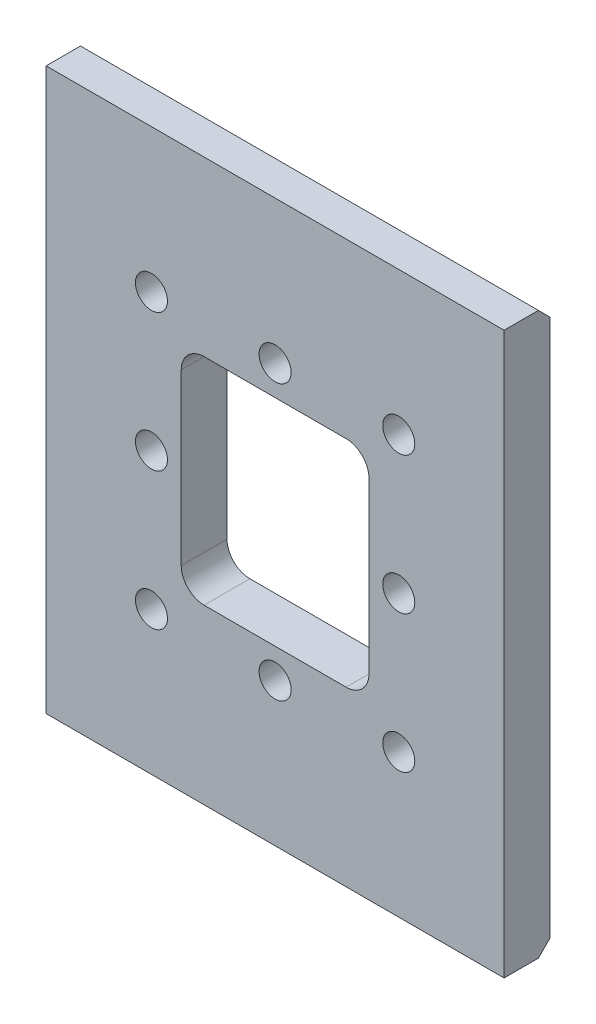
ISO-10303-21;
HEADER;
FILE_DESCRIPTION(('STEP AP214'),'2;1');
FILE_NAME('part.step','',(''),(''),'','','');
FILE_SCHEMA(('AUTOMOTIVE_DESIGN { 1 0 10303 214 1 1 1 1 }'));
ENDSEC;
DATA;
#1=APPLICATION_CONTEXT('core data for automotive mechanical design processes');
#2=APPLICATION_PROTOCOL_DEFINITION('international standard','automotive_design',2000,#1);
#3=PRODUCT_CONTEXT('',#1,'mechanical');
#4=PRODUCT('Part','Part','',(#3));
#5=PRODUCT_RELATED_PRODUCT_CATEGORY('part','',(#4));
#6=PRODUCT_DEFINITION_FORMATION('','',#4);
#7=PRODUCT_DEFINITION_CONTEXT('part definition',#1,'design');
#8=PRODUCT_DEFINITION('design','',#6,#7);
#9=PRODUCT_DEFINITION_SHAPE('','',#8);
#10=(LENGTH_UNIT() NAMED_UNIT(*) SI_UNIT(.MILLI.,.METRE.));
#11=(NAMED_UNIT(*) PLANE_ANGLE_UNIT() SI_UNIT($,.RADIAN.));
#12=(NAMED_UNIT(*) SI_UNIT($,.STERADIAN.) SOLID_ANGLE_UNIT());
#13=UNCERTAINTY_MEASURE_WITH_UNIT(LENGTH_MEASURE(1.E-05),#10,'distance_accuracy_value','');
#14=(GEOMETRIC_REPRESENTATION_CONTEXT(3) GLOBAL_UNCERTAINTY_ASSIGNED_CONTEXT((#13)) GLOBAL_UNIT_ASSIGNED_CONTEXT((#10,
#11,#12)) REPRESENTATION_CONTEXT('',''));
#15=CARTESIAN_POINT('',(0.,0.,0.));
#16=DIRECTION('',(0.,0.,1.));
#17=DIRECTION('',(1.,0.,0.));
#18=AXIS2_PLACEMENT_3D('',#15,#16,#17);
#19=CARTESIAN_POINT('',(100.,122.5,20.));
#20=DIRECTION('',(-1.,0.,0.));
#21=DIRECTION('',(0.,0.,1.));
#22=AXIS2_PLACEMENT_3D('',#19,#20,#21);
#23=PLANE('',#22);
#24=DIRECTION('',(0.,0.,-1.));
#25=VECTOR('',#24,1.);
#26=CARTESIAN_POINT('',(100.,-122.5,20.));
#27=LINE('',#26,#25);
#28=CARTESIAN_POINT('',(100.,-122.5,20.));
#29=VERTEX_POINT('',#28);
#30=CARTESIAN_POINT('',(100.,-122.5,5.));
#31=VERTEX_POINT('',#30);
#32=EDGE_CURVE('E227',#29,#31,#27,.T.);
#33=ORIENTED_EDGE('',*,*,#32,.T.);
#34=DIRECTION('',(0.,-0.707106781186549,0.707106781186546));
#35=VECTOR('',#34,1.);
#36=CARTESIAN_POINT('',(100.,-122.5,5.));
#37=LINE('',#36,#35);
#38=CARTESIAN_POINT('',(100.,-117.5,0.));
#39=VERTEX_POINT('',#38);
#40=EDGE_CURVE('E247',#31,#39,#37,.F.);
#41=ORIENTED_EDGE('',*,*,#40,.T.);
#42=DIRECTION('',(0.,1.,0.));
#43=VECTOR('',#42,1.);
#44=CARTESIAN_POINT('',(100.,122.5,0.));
#45=LINE('',#44,#43);
#46=CARTESIAN_POINT('',(100.,117.5,0.));
#47=VERTEX_POINT('',#46);
#48=EDGE_CURVE('E216',#39,#47,#45,.T.);
#49=ORIENTED_EDGE('',*,*,#48,.T.);
#50=DIRECTION('',(0.,-0.707106781186549,-0.707106781186546));
#51=VECTOR('',#50,1.);
#52=CARTESIAN_POINT('',(100.,122.5,5.));
#53=LINE('',#52,#51);
#54=CARTESIAN_POINT('',(100.,122.5,5.));
#55=VERTEX_POINT('',#54);
#56=EDGE_CURVE('E245',#47,#55,#53,.F.);
#57=ORIENTED_EDGE('',*,*,#56,.T.);
#58=DIRECTION('',(0.,0.,-1.));
#59=VECTOR('',#58,1.);
#60=CARTESIAN_POINT('',(100.,122.5,20.));
#61=LINE('',#60,#59);
#62=CARTESIAN_POINT('',(100.,122.5,20.));
#63=VERTEX_POINT('',#62);
#64=EDGE_CURVE('E239',#63,#55,#61,.T.);
#65=ORIENTED_EDGE('',*,*,#64,.F.);
#66=DIRECTION('',(0.,1.,0.));
#67=VECTOR('',#66,1.);
#68=CARTESIAN_POINT('',(100.,122.5,20.));
#69=LINE('',#68,#67);
#70=EDGE_CURVE('E217',#29,#63,#69,.T.);
#71=ORIENTED_EDGE('',*,*,#70,.F.);
#72=EDGE_LOOP('',(#33,#41,#49,#57,#65,#71));
#73=FACE_BOUND('',#72,.T.);
#74=ADVANCED_FACE('F35',(#73),#23,.F.);
#75=CARTESIAN_POINT('',(-100.,122.5,20.));
#76=DIRECTION('',(0.,-1.,0.));
#77=DIRECTION('',(0.,0.,-1.));
#78=AXIS2_PLACEMENT_3D('',#75,#76,#77);
#79=PLANE('',#78);
#80=ORIENTED_EDGE('',*,*,#64,.T.);
#81=DIRECTION('',(-1.,0.,0.));
#82=VECTOR('',#81,1.);
#83=CARTESIAN_POINT('',(-100.,122.5,5.));
#84=LINE('',#83,#82);
#85=CARTESIAN_POINT('',(-100.,122.5,5.));
#86=VERTEX_POINT('',#85);
#87=EDGE_CURVE('E11',#55,#86,#84,.T.);
#88=ORIENTED_EDGE('',*,*,#87,.T.);
#89=DIRECTION('',(0.,0.,-1.));
#90=VECTOR('',#89,1.);
#91=CARTESIAN_POINT('',(-100.,122.5,20.));
#92=LINE('',#91,#90);
#93=CARTESIAN_POINT('',(-100.,122.5,20.));
#94=VERTEX_POINT('',#93);
#95=EDGE_CURVE('E236',#94,#86,#92,.T.);
#96=ORIENTED_EDGE('',*,*,#95,.F.);
#97=DIRECTION('',(-1.,0.,0.));
#98=VECTOR('',#97,1.);
#99=CARTESIAN_POINT('',(-100.,122.5,20.));
#100=LINE('',#99,#98);
#101=EDGE_CURVE('E220',#63,#94,#100,.T.);
#102=ORIENTED_EDGE('',*,*,#101,.F.);
#103=EDGE_LOOP('',(#80,#88,#96,#102));
#104=FACE_BOUND('',#103,.T.);
#105=ADVANCED_FACE('F269',(#104),#79,.F.);
#106=CARTESIAN_POINT('',(-100.,122.5,20.));
#107=DIRECTION('',(1.,0.,0.));
#108=DIRECTION('',(0.,1.,0.));
#109=AXIS2_PLACEMENT_3D('',#106,#107,#108);
#110=PLANE('',#109);
#111=DIRECTION('',(0.,-1.,0.));
#112=VECTOR('',#111,1.);
#113=CARTESIAN_POINT('',(-100.,122.5,0.));
#114=LINE('',#113,#112);
#115=CARTESIAN_POINT('',(-100.,117.5,0.));
#116=VERTEX_POINT('',#115);
#117=CARTESIAN_POINT('',(-100.,-117.5,0.));
#118=VERTEX_POINT('',#117);
#119=EDGE_CURVE('E221',#116,#118,#114,.T.);
#120=ORIENTED_EDGE('',*,*,#119,.T.);
#121=DIRECTION('',(0.,0.707106781186549,-0.707106781186546));
#122=VECTOR('',#121,1.);
#123=CARTESIAN_POINT('',(-100.,-122.5,5.));
#124=LINE('',#123,#122);
#125=CARTESIAN_POINT('',(-100.,-122.5,5.));
#126=VERTEX_POINT('',#125);
#127=EDGE_CURVE('E43',#118,#126,#124,.F.);
#128=ORIENTED_EDGE('',*,*,#127,.T.);
#129=DIRECTION('',(0.,0.,-1.));
#130=VECTOR('',#129,1.);
#131=CARTESIAN_POINT('',(-100.,-122.5,20.));
#132=LINE('',#131,#130);
#133=CARTESIAN_POINT('',(-100.,-122.5,20.));
#134=VERTEX_POINT('',#133);
#135=EDGE_CURVE('E233',#134,#126,#132,.T.);
#136=ORIENTED_EDGE('',*,*,#135,.F.);
#137=DIRECTION('',(0.,-1.,0.));
#138=VECTOR('',#137,1.);
#139=CARTESIAN_POINT('',(-100.,122.5,20.));
#140=LINE('',#139,#138);
#141=EDGE_CURVE('E223',#94,#134,#140,.T.);
#142=ORIENTED_EDGE('',*,*,#141,.F.);
#143=ORIENTED_EDGE('',*,*,#95,.T.);
#144=DIRECTION('',(0.,0.707106781186549,0.707106781186546));
#145=VECTOR('',#144,1.);
#146=CARTESIAN_POINT('',(-100.,122.5,5.));
#147=LINE('',#146,#145);
#148=EDGE_CURVE('E50',#86,#116,#147,.F.);
#149=ORIENTED_EDGE('',*,*,#148,.T.);
#150=EDGE_LOOP('',(#120,#128,#136,#142,#143,#149));
#151=FACE_BOUND('',#150,.T.);
#152=ADVANCED_FACE('F255',(#151),#110,.F.);
#153=CARTESIAN_POINT('',(-100.,-122.5,20.));
#154=DIRECTION('',(0.,1.,0.));
#155=DIRECTION('',(0.,0.,1.));
#156=AXIS2_PLACEMENT_3D('',#153,#154,#155);
#157=PLANE('',#156);
#158=ORIENTED_EDGE('',*,*,#135,.T.);
#159=DIRECTION('',(1.,0.,0.));
#160=VECTOR('',#159,1.);
#161=CARTESIAN_POINT('',(-100.,-122.5,5.));
#162=LINE('',#161,#160);
#163=EDGE_CURVE('E242',#126,#31,#162,.T.);
#164=ORIENTED_EDGE('',*,*,#163,.T.);
#165=ORIENTED_EDGE('',*,*,#32,.F.);
#166=DIRECTION('',(1.,0.,0.));
#167=VECTOR('',#166,1.);
#168=CARTESIAN_POINT('',(-100.,-122.5,20.));
#169=LINE('',#168,#167);
#170=EDGE_CURVE('E225',#134,#29,#169,.T.);
#171=ORIENTED_EDGE('',*,*,#170,.F.);
#172=EDGE_LOOP('',(#158,#164,#165,#171));
#173=FACE_BOUND('',#172,.T.);
#174=ADVANCED_FACE('F261',(#173),#157,.F.);
#175=CARTESIAN_POINT('',(0.,0.,20.));
#176=DIRECTION('',(0.,0.,1.));
#177=DIRECTION('',(1.,0.,0.));
#178=AXIS2_PLACEMENT_3D('',#175,#176,#177);
#179=PLANE('',#178);
#180=CARTESIAN_POINT('',(54.,0.,20.));
#181=DIRECTION('',(0.,0.,1.));
#182=DIRECTION('',(1.,0.,0.));
#183=AXIS2_PLACEMENT_3D('',#180,#181,#182);
#184=CIRCLE('',#183,7.);
#185=CARTESIAN_POINT('',(61.,0.,20.));
#186=VERTEX_POINT('',#185);
#187=EDGE_CURVE('E523',#186,#186,#184,.T.);
#188=ORIENTED_EDGE('',*,*,#187,.F.);
#189=EDGE_LOOP('',(#188));
#190=FACE_BOUND('',#189,.T.);
#191=CARTESIAN_POINT('',(-54.,-60.,20.));
#192=DIRECTION('',(0.,0.,1.));
#193=DIRECTION('',(1.,0.,0.));
#194=AXIS2_PLACEMENT_3D('',#191,#192,#193);
#195=CIRCLE('',#194,7.);
#196=CARTESIAN_POINT('',(-47.,-60.,20.));
#197=VERTEX_POINT('',#196);
#198=EDGE_CURVE('E510',#197,#197,#195,.T.);
#199=ORIENTED_EDGE('',*,*,#198,.F.);
#200=EDGE_LOOP('',(#199));
#201=FACE_BOUND('',#200,.T.);
#202=CARTESIAN_POINT('',(0.,-60.,20.));
#203=DIRECTION('',(0.,0.,1.));
#204=DIRECTION('',(1.,0.,0.));
#205=AXIS2_PLACEMENT_3D('',#202,#203,#204);
#206=CIRCLE('',#205,7.);
#207=CARTESIAN_POINT('',(6.99999999999995,-60.,20.));
#208=VERTEX_POINT('',#207);
#209=EDGE_CURVE('E505',#208,#208,#206,.T.);
#210=ORIENTED_EDGE('',*,*,#209,.F.);
#211=EDGE_LOOP('',(#210));
#212=FACE_BOUND('',#211,.T.);
#213=CARTESIAN_POINT('',(54.,-60.,20.));
#214=DIRECTION('',(0.,0.,1.));
#215=DIRECTION('',(1.,0.,0.));
#216=AXIS2_PLACEMENT_3D('',#213,#214,#215);
#217=CIRCLE('',#216,7.);
#218=CARTESIAN_POINT('',(61.,-60.,20.));
#219=VERTEX_POINT('',#218);
#220=EDGE_CURVE('E518',#219,#219,#217,.T.);
#221=ORIENTED_EDGE('',*,*,#220,.F.);
#222=EDGE_LOOP('',(#221));
#223=FACE_BOUND('',#222,.T.);
#224=CARTESIAN_POINT('',(-31.,-37.,20.));
#225=DIRECTION('',(0.,0.,1.));
#226=DIRECTION('',(1.,0.,0.));
#227=AXIS2_PLACEMENT_3D('',#224,#225,#226);
#228=CIRCLE('',#227,10.);
#229=CARTESIAN_POINT('',(-41.,-37.,20.));
#230=VERTEX_POINT('',#229);
#231=CARTESIAN_POINT('',(-30.9999999999999,-47.,20.));
#232=VERTEX_POINT('',#231);
#233=EDGE_CURVE('E145',#230,#232,#228,.T.);
#234=ORIENTED_EDGE('',*,*,#233,.F.);
#235=DIRECTION('',(0.,-1.,0.));
#236=VECTOR('',#235,1.);
#237=CARTESIAN_POINT('',(-41.,37.,20.));
#238=LINE('',#237,#236);
#239=CARTESIAN_POINT('',(-41.,37.,20.));
#240=VERTEX_POINT('',#239);
#241=EDGE_CURVE('E150',#240,#230,#238,.T.);
#242=ORIENTED_EDGE('',*,*,#241,.F.);
#243=CARTESIAN_POINT('',(-31.,37.,20.));
#244=DIRECTION('',(0.,0.,1.));
#245=DIRECTION('',(1.,0.,0.));
#246=AXIS2_PLACEMENT_3D('',#243,#244,#245);
#247=CIRCLE('',#246,10.);
#248=CARTESIAN_POINT('',(-30.9999999999999,47.,20.));
#249=VERTEX_POINT('',#248);
#250=EDGE_CURVE('E186',#249,#240,#247,.T.);
#251=ORIENTED_EDGE('',*,*,#250,.F.);
#252=DIRECTION('',(-1.,0.,0.));
#253=VECTOR('',#252,1.);
#254=CARTESIAN_POINT('',(-30.9999999999999,47.,20.));
#255=LINE('',#254,#253);
#256=CARTESIAN_POINT('',(30.9999999999999,47.,20.));
#257=VERTEX_POINT('',#256);
#258=EDGE_CURVE('E183',#257,#249,#255,.T.);
#259=ORIENTED_EDGE('',*,*,#258,.F.);
#260=CARTESIAN_POINT('',(31.,37.,20.));
#261=DIRECTION('',(0.,0.,1.));
#262=DIRECTION('',(-1.,0.,0.));
#263=AXIS2_PLACEMENT_3D('',#260,#261,#262);
#264=CIRCLE('',#263,10.);
#265=CARTESIAN_POINT('',(41.,37.,20.));
#266=VERTEX_POINT('',#265);
#267=EDGE_CURVE('E180',#266,#257,#264,.T.);
#268=ORIENTED_EDGE('',*,*,#267,.F.);
#269=DIRECTION('',(0.,1.,0.));
#270=VECTOR('',#269,1.);
#271=CARTESIAN_POINT('',(41.,37.,20.));
#272=LINE('',#271,#270);
#273=CARTESIAN_POINT('',(41.,-37.,20.));
#274=VERTEX_POINT('',#273);
#275=EDGE_CURVE('E177',#274,#266,#272,.T.);
#276=ORIENTED_EDGE('',*,*,#275,.F.);
#277=CARTESIAN_POINT('',(31.,-37.,20.));
#278=DIRECTION('',(0.,0.,1.));
#279=DIRECTION('',(1.,0.,0.));
#280=AXIS2_PLACEMENT_3D('',#277,#278,#279);
#281=CIRCLE('',#280,10.);
#282=CARTESIAN_POINT('',(30.9999999999999,-47.,20.));
#283=VERTEX_POINT('',#282);
#284=EDGE_CURVE('E174',#283,#274,#281,.T.);
#285=ORIENTED_EDGE('',*,*,#284,.F.);
#286=DIRECTION('',(1.,0.,0.));
#287=VECTOR('',#286,1.);
#288=CARTESIAN_POINT('',(-30.9999999999999,-47.,20.));
#289=LINE('',#288,#287);
#290=EDGE_CURVE('E167',#232,#283,#289,.T.);
#291=ORIENTED_EDGE('',*,*,#290,.F.);
#292=EDGE_LOOP('',(#234,#242,#251,#259,#268,#276,#285,#291));
#293=FACE_BOUND('',#292,.T.);
#294=CARTESIAN_POINT('',(0.,60.,20.));
#295=DIRECTION('',(0.,0.,1.));
#296=DIRECTION('',(1.,0.,0.));
#297=AXIS2_PLACEMENT_3D('',#294,#295,#296);
#298=CIRCLE('',#297,7.);
#299=CARTESIAN_POINT('',(6.99999999999995,60.,20.));
#300=VERTEX_POINT('',#299);
#301=EDGE_CURVE('E203',#300,#300,#298,.T.);
#302=ORIENTED_EDGE('',*,*,#301,.F.);
#303=EDGE_LOOP('',(#302));
#304=FACE_BOUND('',#303,.T.);
#305=CARTESIAN_POINT('',(54.,60.,20.));
#306=DIRECTION('',(0.,0.,1.));
#307=DIRECTION('',(1.,0.,0.));
#308=AXIS2_PLACEMENT_3D('',#305,#306,#307);
#309=CIRCLE('',#308,7.);
#310=CARTESIAN_POINT('',(61.,60.,20.));
#311=VERTEX_POINT('',#310);
#312=EDGE_CURVE('E531',#311,#311,#309,.T.);
#313=ORIENTED_EDGE('',*,*,#312,.F.);
#314=EDGE_LOOP('',(#313));
#315=FACE_BOUND('',#314,.T.);
#316=CARTESIAN_POINT('',(-54.,0.,20.));
#317=DIRECTION('',(0.,0.,1.));
#318=DIRECTION('',(1.,0.,0.));
#319=AXIS2_PLACEMENT_3D('',#316,#317,#318);
#320=CIRCLE('',#319,7.);
#321=CARTESIAN_POINT('',(-47.,0.,20.));
#322=VERTEX_POINT('',#321);
#323=EDGE_CURVE('E527',#322,#322,#320,.T.);
#324=ORIENTED_EDGE('',*,*,#323,.F.);
#325=EDGE_LOOP('',(#324));
#326=FACE_BOUND('',#325,.T.);
#327=CARTESIAN_POINT('',(-54.,60.,20.));
#328=DIRECTION('',(0.,0.,1.));
#329=DIRECTION('',(1.,0.,0.));
#330=AXIS2_PLACEMENT_3D('',#327,#328,#329);
#331=CIRCLE('',#330,7.);
#332=CARTESIAN_POINT('',(-47.,60.,20.));
#333=VERTEX_POINT('',#332);
#334=EDGE_CURVE('E158',#333,#333,#331,.T.);
#335=ORIENTED_EDGE('',*,*,#334,.F.);
#336=EDGE_LOOP('',(#335));
#337=FACE_BOUND('',#336,.T.);
#338=ORIENTED_EDGE('',*,*,#70,.T.);
#339=ORIENTED_EDGE('',*,*,#101,.T.);
#340=ORIENTED_EDGE('',*,*,#141,.T.);
#341=ORIENTED_EDGE('',*,*,#170,.T.);
#342=EDGE_LOOP('',(#338,#339,#340,#341));
#343=FACE_BOUND('',#342,.T.);
#344=ADVANCED_FACE('F272',(#190,#201,#212,#223,#293,#304,#315,#326,#337,#343),#179,.T.);
#345=CARTESIAN_POINT('',(0.,0.,0.));
#346=DIRECTION('',(0.,0.,1.));
#347=DIRECTION('',(1.,0.,0.));
#348=AXIS2_PLACEMENT_3D('',#345,#346,#347);
#349=PLANE('',#348);
#350=CARTESIAN_POINT('',(54.,0.,0.));
#351=DIRECTION('',(0.,0.,1.));
#352=DIRECTION('',(1.,0.,0.));
#353=AXIS2_PLACEMENT_3D('',#350,#351,#352);
#354=CIRCLE('',#353,7.);
#355=CARTESIAN_POINT('',(61.,0.,0.));
#356=VERTEX_POINT('',#355);
#357=EDGE_CURVE('E525',#356,#356,#354,.F.);
#358=ORIENTED_EDGE('',*,*,#357,.F.);
#359=EDGE_LOOP('',(#358));
#360=FACE_BOUND('',#359,.T.);
#361=CARTESIAN_POINT('',(-54.,-60.,0.));
#362=DIRECTION('',(0.,0.,1.));
#363=DIRECTION('',(1.,0.,0.));
#364=AXIS2_PLACEMENT_3D('',#361,#362,#363);
#365=CIRCLE('',#364,7.);
#366=CARTESIAN_POINT('',(-47.,-60.,0.));
#367=VERTEX_POINT('',#366);
#368=EDGE_CURVE('E513',#367,#367,#365,.F.);
#369=ORIENTED_EDGE('',*,*,#368,.F.);
#370=EDGE_LOOP('',(#369));
#371=FACE_BOUND('',#370,.T.);
#372=CARTESIAN_POINT('',(0.,-60.,0.));
#373=DIRECTION('',(0.,0.,1.));
#374=DIRECTION('',(1.,0.,0.));
#375=AXIS2_PLACEMENT_3D('',#372,#373,#374);
#376=CIRCLE('',#375,7.);
#377=CARTESIAN_POINT('',(6.99999999999995,-60.,0.));
#378=VERTEX_POINT('',#377);
#379=EDGE_CURVE('E508',#378,#378,#376,.F.);
#380=ORIENTED_EDGE('',*,*,#379,.F.);
#381=EDGE_LOOP('',(#380));
#382=FACE_BOUND('',#381,.T.);
#383=CARTESIAN_POINT('',(54.,-60.,0.));
#384=DIRECTION('',(0.,0.,1.));
#385=DIRECTION('',(1.,0.,0.));
#386=AXIS2_PLACEMENT_3D('',#383,#384,#385);
#387=CIRCLE('',#386,7.);
#388=CARTESIAN_POINT('',(61.,-60.,0.));
#389=VERTEX_POINT('',#388);
#390=EDGE_CURVE('E515',#389,#389,#387,.F.);
#391=ORIENTED_EDGE('',*,*,#390,.F.);
#392=EDGE_LOOP('',(#391));
#393=FACE_BOUND('',#392,.T.);
#394=DIRECTION('',(0.,1.,0.));
#395=VECTOR('',#394,1.);
#396=CARTESIAN_POINT('',(-41.,37.,0.));
#397=LINE('',#396,#395);
#398=CARTESIAN_POINT('',(-41.,-37.,0.));
#399=VERTEX_POINT('',#398);
#400=CARTESIAN_POINT('',(-41.,37.,0.));
#401=VERTEX_POINT('',#400);
#402=EDGE_CURVE('E165',#399,#401,#397,.T.);
#403=ORIENTED_EDGE('',*,*,#402,.F.);
#404=CARTESIAN_POINT('',(-31.,-37.,0.));
#405=DIRECTION('',(0.,0.,1.));
#406=DIRECTION('',(1.,0.,0.));
#407=AXIS2_PLACEMENT_3D('',#404,#405,#406);
#408=CIRCLE('',#407,10.);
#409=CARTESIAN_POINT('',(-30.9999999999999,-47.,0.));
#410=VERTEX_POINT('',#409);
#411=EDGE_CURVE('E142',#410,#399,#408,.F.);
#412=ORIENTED_EDGE('',*,*,#411,.F.);
#413=DIRECTION('',(-1.,0.,0.));
#414=VECTOR('',#413,1.);
#415=CARTESIAN_POINT('',(-30.9999999999999,-47.,0.));
#416=LINE('',#415,#414);
#417=CARTESIAN_POINT('',(30.9999999999999,-47.,0.));
#418=VERTEX_POINT('',#417);
#419=EDGE_CURVE('E154',#418,#410,#416,.T.);
#420=ORIENTED_EDGE('',*,*,#419,.F.);
#421=CARTESIAN_POINT('',(31.,-37.,0.));
#422=DIRECTION('',(0.,0.,1.));
#423=DIRECTION('',(1.,0.,0.));
#424=AXIS2_PLACEMENT_3D('',#421,#422,#423);
#425=CIRCLE('',#424,10.);
#426=CARTESIAN_POINT('',(41.,-37.,0.));
#427=VERTEX_POINT('',#426);
#428=EDGE_CURVE('E210',#427,#418,#425,.F.);
#429=ORIENTED_EDGE('',*,*,#428,.F.);
#430=DIRECTION('',(0.,-1.,0.));
#431=VECTOR('',#430,1.);
#432=CARTESIAN_POINT('',(41.,37.,0.));
#433=LINE('',#432,#431);
#434=CARTESIAN_POINT('',(41.,37.,0.));
#435=VERTEX_POINT('',#434);
#436=EDGE_CURVE('E542',#435,#427,#433,.T.);
#437=ORIENTED_EDGE('',*,*,#436,.F.);
#438=CARTESIAN_POINT('',(31.,37.,0.));
#439=DIRECTION('',(0.,0.,1.));
#440=DIRECTION('',(1.,0.,0.));
#441=AXIS2_PLACEMENT_3D('',#438,#439,#440);
#442=CIRCLE('',#441,10.);
#443=CARTESIAN_POINT('',(30.9999999999999,47.,0.));
#444=VERTEX_POINT('',#443);
#445=EDGE_CURVE('E545',#444,#435,#442,.F.);
#446=ORIENTED_EDGE('',*,*,#445,.F.);
#447=DIRECTION('',(1.,0.,0.));
#448=VECTOR('',#447,1.);
#449=CARTESIAN_POINT('',(-30.9999999999999,47.,0.));
#450=LINE('',#449,#448);
#451=CARTESIAN_POINT('',(-30.9999999999999,47.,0.));
#452=VERTEX_POINT('',#451);
#453=EDGE_CURVE('E548',#452,#444,#450,.T.);
#454=ORIENTED_EDGE('',*,*,#453,.F.);
#455=CARTESIAN_POINT('',(-31.,37.,0.));
#456=DIRECTION('',(0.,0.,1.));
#457=DIRECTION('',(1.,0.,0.));
#458=AXIS2_PLACEMENT_3D('',#455,#456,#457);
#459=CIRCLE('',#458,10.);
#460=EDGE_CURVE('E169',#401,#452,#459,.F.);
#461=ORIENTED_EDGE('',*,*,#460,.F.);
#462=EDGE_LOOP('',(#403,#412,#420,#429,#437,#446,#454,#461));
#463=FACE_BOUND('',#462,.T.);
#464=CARTESIAN_POINT('',(0.,60.,0.));
#465=DIRECTION('',(0.,0.,1.));
#466=DIRECTION('',(1.,0.,0.));
#467=AXIS2_PLACEMENT_3D('',#464,#465,#466);
#468=CIRCLE('',#467,7.);
#469=CARTESIAN_POINT('',(6.99999999999995,60.,0.));
#470=VERTEX_POINT('',#469);
#471=EDGE_CURVE('E206',#470,#470,#468,.F.);
#472=ORIENTED_EDGE('',*,*,#471,.F.);
#473=EDGE_LOOP('',(#472));
#474=FACE_BOUND('',#473,.T.);
#475=CARTESIAN_POINT('',(54.,60.,0.));
#476=DIRECTION('',(0.,0.,1.));
#477=DIRECTION('',(1.,0.,0.));
#478=AXIS2_PLACEMENT_3D('',#475,#476,#477);
#479=CIRCLE('',#478,7.);
#480=CARTESIAN_POINT('',(61.,60.,0.));
#481=VERTEX_POINT('',#480);
#482=EDGE_CURVE('E207',#481,#481,#479,.F.);
#483=ORIENTED_EDGE('',*,*,#482,.F.);
#484=EDGE_LOOP('',(#483));
#485=FACE_BOUND('',#484,.T.);
#486=CARTESIAN_POINT('',(-54.,0.,0.));
#487=DIRECTION('',(0.,0.,1.));
#488=DIRECTION('',(1.,0.,0.));
#489=AXIS2_PLACEMENT_3D('',#486,#487,#488);
#490=CIRCLE('',#489,7.);
#491=CARTESIAN_POINT('',(-47.,0.,0.));
#492=VERTEX_POINT('',#491);
#493=EDGE_CURVE('E534',#492,#492,#490,.F.);
#494=ORIENTED_EDGE('',*,*,#493,.F.);
#495=EDGE_LOOP('',(#494));
#496=FACE_BOUND('',#495,.T.);
#497=CARTESIAN_POINT('',(-54.,60.,0.));
#498=DIRECTION('',(0.,0.,1.));
#499=DIRECTION('',(1.,0.,0.));
#500=AXIS2_PLACEMENT_3D('',#497,#498,#499);
#501=CIRCLE('',#500,7.);
#502=CARTESIAN_POINT('',(-47.,60.,0.));
#503=VERTEX_POINT('',#502);
#504=EDGE_CURVE('E213',#503,#503,#501,.F.);
#505=ORIENTED_EDGE('',*,*,#504,.F.);
#506=EDGE_LOOP('',(#505));
#507=FACE_BOUND('',#506,.T.);
#508=ORIENTED_EDGE('',*,*,#48,.F.);
#509=DIRECTION('',(-1.,0.,0.));
#510=VECTOR('',#509,1.);
#511=CARTESIAN_POINT('',(0.,-117.5,0.));
#512=LINE('',#511,#510);
#513=EDGE_CURVE('E57',#39,#118,#512,.T.);
#514=ORIENTED_EDGE('',*,*,#513,.T.);
#515=ORIENTED_EDGE('',*,*,#119,.F.);
#516=DIRECTION('',(1.,0.,0.));
#517=VECTOR('',#516,1.);
#518=CARTESIAN_POINT('',(0.,117.5,0.));
#519=LINE('',#518,#517);
#520=EDGE_CURVE('E249',#116,#47,#519,.T.);
#521=ORIENTED_EDGE('',*,*,#520,.T.);
#522=EDGE_LOOP('',(#508,#514,#515,#521));
#523=FACE_BOUND('',#522,.T.);
#524=ADVANCED_FACE('F161',(#360,#371,#382,#393,#463,#474,#485,#496,#507,#523),#349,.F.);
#525=CARTESIAN_POINT('',(-54.,60.,-0.001000000000001));
#526=DIRECTION('',(0.,0.,1.));
#527=DIRECTION('',(1.,0.,0.));
#528=AXIS2_PLACEMENT_3D('',#525,#526,#527);
#529=CYLINDRICAL_SURFACE('',#528,7.);
#530=ORIENTED_EDGE('',*,*,#334,.T.);
#531=EDGE_LOOP('',(#530));
#532=FACE_BOUND('',#531,.T.);
#533=ORIENTED_EDGE('',*,*,#504,.T.);
#534=EDGE_LOOP('',(#533));
#535=FACE_BOUND('',#534,.T.);
#536=ADVANCED_FACE('F280',(#532,#535),#529,.F.);
#537=CARTESIAN_POINT('',(-54.,0.,-0.001000000000001));
#538=DIRECTION('',(0.,0.,1.));
#539=DIRECTION('',(1.,0.,0.));
#540=AXIS2_PLACEMENT_3D('',#537,#538,#539);
#541=CYLINDRICAL_SURFACE('',#540,7.);
#542=ORIENTED_EDGE('',*,*,#323,.T.);
#543=EDGE_LOOP('',(#542));
#544=FACE_BOUND('',#543,.T.);
#545=ORIENTED_EDGE('',*,*,#493,.T.);
#546=EDGE_LOOP('',(#545));
#547=FACE_BOUND('',#546,.T.);
#548=ADVANCED_FACE('F319',(#544,#547),#541,.F.);
#549=CARTESIAN_POINT('',(54.,60.,-0.001000000000001));
#550=DIRECTION('',(0.,0.,1.));
#551=DIRECTION('',(1.,0.,0.));
#552=AXIS2_PLACEMENT_3D('',#549,#550,#551);
#553=CYLINDRICAL_SURFACE('',#552,7.);
#554=ORIENTED_EDGE('',*,*,#312,.T.);
#555=EDGE_LOOP('',(#554));
#556=FACE_BOUND('',#555,.T.);
#557=ORIENTED_EDGE('',*,*,#482,.T.);
#558=EDGE_LOOP('',(#557));
#559=FACE_BOUND('',#558,.T.);
#560=ADVANCED_FACE('F315',(#556,#559),#553,.F.);
#561=CARTESIAN_POINT('',(0.,60.,-0.001000000000001));
#562=DIRECTION('',(0.,0.,1.));
#563=DIRECTION('',(1.,0.,0.));
#564=AXIS2_PLACEMENT_3D('',#561,#562,#563);
#565=CYLINDRICAL_SURFACE('',#564,7.);
#566=ORIENTED_EDGE('',*,*,#301,.T.);
#567=EDGE_LOOP('',(#566));
#568=FACE_BOUND('',#567,.T.);
#569=ORIENTED_EDGE('',*,*,#471,.T.);
#570=EDGE_LOOP('',(#569));
#571=FACE_BOUND('',#570,.T.);
#572=ADVANCED_FACE('F318',(#568,#571),#565,.F.);
#573=CARTESIAN_POINT('',(-31.,-37.,-0.001000000000001));
#574=DIRECTION('',(0.,0.,1.));
#575=DIRECTION('',(1.,0.,0.));
#576=AXIS2_PLACEMENT_3D('',#573,#574,#575);
#577=CYLINDRICAL_SURFACE('',#576,10.);
#578=ORIENTED_EDGE('',*,*,#411,.T.);
#579=DIRECTION('',(0.,0.,1.));
#580=VECTOR('',#579,1.);
#581=CARTESIAN_POINT('',(-41.,-37.,-0.001000000000001));
#582=LINE('',#581,#580);
#583=EDGE_CURVE('E159',#399,#230,#582,.T.);
#584=ORIENTED_EDGE('',*,*,#583,.T.);
#585=ORIENTED_EDGE('',*,*,#233,.T.);
#586=DIRECTION('',(0.,0.,1.));
#587=VECTOR('',#586,1.);
#588=CARTESIAN_POINT('',(-30.9999999999999,-47.,-0.001000000000001));
#589=LINE('',#588,#587);
#590=EDGE_CURVE('E138',#410,#232,#589,.T.);
#591=ORIENTED_EDGE('',*,*,#590,.F.);
#592=EDGE_LOOP('',(#578,#584,#585,#591));
#593=FACE_BOUND('',#592,.T.);
#594=ADVANCED_FACE('F140',(#593),#577,.F.);
#595=CARTESIAN_POINT('',(-41.,37.,-0.001000000000001));
#596=DIRECTION('',(-1.,0.,0.));
#597=DIRECTION('',(0.,-1.,0.));
#598=AXIS2_PLACEMENT_3D('',#595,#596,#597);
#599=PLANE('',#598);
#600=ORIENTED_EDGE('',*,*,#402,.T.);
#601=DIRECTION('',(0.,0.,1.));
#602=VECTOR('',#601,1.);
#603=CARTESIAN_POINT('',(-41.,37.,-0.001000000000001));
#604=LINE('',#603,#602);
#605=EDGE_CURVE('E192',#401,#240,#604,.T.);
#606=ORIENTED_EDGE('',*,*,#605,.T.);
#607=ORIENTED_EDGE('',*,*,#241,.T.);
#608=ORIENTED_EDGE('',*,*,#583,.F.);
#609=EDGE_LOOP('',(#600,#606,#607,#608));
#610=FACE_BOUND('',#609,.T.);
#611=ADVANCED_FACE('F324',(#610),#599,.F.);
#612=CARTESIAN_POINT('',(-31.,37.,-0.001000000000001));
#613=DIRECTION('',(0.,0.,1.));
#614=DIRECTION('',(1.,0.,0.));
#615=AXIS2_PLACEMENT_3D('',#612,#613,#614);
#616=CYLINDRICAL_SURFACE('',#615,10.);
#617=ORIENTED_EDGE('',*,*,#460,.T.);
#618=DIRECTION('',(0.,0.,1.));
#619=VECTOR('',#618,1.);
#620=CARTESIAN_POINT('',(-30.9999999999999,47.,-0.001000000000001));
#621=LINE('',#620,#619);
#622=EDGE_CURVE('E194',#452,#249,#621,.T.);
#623=ORIENTED_EDGE('',*,*,#622,.T.);
#624=ORIENTED_EDGE('',*,*,#250,.T.);
#625=ORIENTED_EDGE('',*,*,#605,.F.);
#626=EDGE_LOOP('',(#617,#623,#624,#625));
#627=FACE_BOUND('',#626,.T.);
#628=ADVANCED_FACE('F327',(#627),#616,.F.);
#629=CARTESIAN_POINT('',(-30.9999999999999,47.,-0.001000000000001));
#630=DIRECTION('',(0.,1.,0.));
#631=DIRECTION('',(0.,0.,1.));
#632=AXIS2_PLACEMENT_3D('',#629,#630,#631);
#633=PLANE('',#632);
#634=ORIENTED_EDGE('',*,*,#453,.T.);
#635=DIRECTION('',(0.,0.,1.));
#636=VECTOR('',#635,1.);
#637=CARTESIAN_POINT('',(30.9999999999999,47.,-0.001000000000001));
#638=LINE('',#637,#636);
#639=EDGE_CURVE('E196',#444,#257,#638,.T.);
#640=ORIENTED_EDGE('',*,*,#639,.T.);
#641=ORIENTED_EDGE('',*,*,#258,.T.);
#642=ORIENTED_EDGE('',*,*,#622,.F.);
#643=EDGE_LOOP('',(#634,#640,#641,#642));
#644=FACE_BOUND('',#643,.T.);
#645=ADVANCED_FACE('F331',(#644),#633,.F.);
#646=CARTESIAN_POINT('',(31.,37.,-0.001000000000001));
#647=DIRECTION('',(0.,0.,1.));
#648=DIRECTION('',(1.,0.,0.));
#649=AXIS2_PLACEMENT_3D('',#646,#647,#648);
#650=CYLINDRICAL_SURFACE('',#649,10.);
#651=ORIENTED_EDGE('',*,*,#445,.T.);
#652=DIRECTION('',(0.,0.,1.));
#653=VECTOR('',#652,1.);
#654=CARTESIAN_POINT('',(41.,37.,-0.001000000000001));
#655=LINE('',#654,#653);
#656=EDGE_CURVE('E198',#435,#266,#655,.T.);
#657=ORIENTED_EDGE('',*,*,#656,.T.);
#658=ORIENTED_EDGE('',*,*,#267,.T.);
#659=ORIENTED_EDGE('',*,*,#639,.F.);
#660=EDGE_LOOP('',(#651,#657,#658,#659));
#661=FACE_BOUND('',#660,.T.);
#662=ADVANCED_FACE('F335',(#661),#650,.F.);
#663=CARTESIAN_POINT('',(41.,37.,-0.001000000000001));
#664=DIRECTION('',(1.,0.,0.));
#665=DIRECTION('',(0.,1.,0.));
#666=AXIS2_PLACEMENT_3D('',#663,#664,#665);
#667=PLANE('',#666);
#668=ORIENTED_EDGE('',*,*,#436,.T.);
#669=DIRECTION('',(0.,0.,1.));
#670=VECTOR('',#669,1.);
#671=CARTESIAN_POINT('',(41.,-37.,-0.001000000000001));
#672=LINE('',#671,#670);
#673=EDGE_CURVE('E200',#427,#274,#672,.T.);
#674=ORIENTED_EDGE('',*,*,#673,.T.);
#675=ORIENTED_EDGE('',*,*,#275,.T.);
#676=ORIENTED_EDGE('',*,*,#656,.F.);
#677=EDGE_LOOP('',(#668,#674,#675,#676));
#678=FACE_BOUND('',#677,.T.);
#679=ADVANCED_FACE('F339',(#678),#667,.F.);
#680=CARTESIAN_POINT('',(31.,-37.,-0.001000000000001));
#681=DIRECTION('',(0.,0.,1.));
#682=DIRECTION('',(1.,0.,0.));
#683=AXIS2_PLACEMENT_3D('',#680,#681,#682);
#684=CYLINDRICAL_SURFACE('',#683,10.);
#685=ORIENTED_EDGE('',*,*,#428,.T.);
#686=DIRECTION('',(0.,0.,1.));
#687=VECTOR('',#686,1.);
#688=CARTESIAN_POINT('',(30.9999999999999,-47.,-0.001000000000001));
#689=LINE('',#688,#687);
#690=EDGE_CURVE('E149',#418,#283,#689,.T.);
#691=ORIENTED_EDGE('',*,*,#690,.T.);
#692=ORIENTED_EDGE('',*,*,#284,.T.);
#693=ORIENTED_EDGE('',*,*,#673,.F.);
#694=EDGE_LOOP('',(#685,#691,#692,#693));
#695=FACE_BOUND('',#694,.T.);
#696=ADVANCED_FACE('F343',(#695),#684,.F.);
#697=CARTESIAN_POINT('',(-30.9999999999999,-47.,-0.001000000000001));
#698=DIRECTION('',(0.,-1.,0.));
#699=DIRECTION('',(0.,0.,-1.));
#700=AXIS2_PLACEMENT_3D('',#697,#698,#699);
#701=PLANE('',#700);
#702=ORIENTED_EDGE('',*,*,#419,.T.);
#703=ORIENTED_EDGE('',*,*,#590,.T.);
#704=ORIENTED_EDGE('',*,*,#290,.T.);
#705=ORIENTED_EDGE('',*,*,#690,.F.);
#706=EDGE_LOOP('',(#702,#703,#704,#705));
#707=FACE_BOUND('',#706,.T.);
#708=ADVANCED_FACE('F155',(#707),#701,.F.);
#709=CARTESIAN_POINT('',(54.,-60.,-0.001000000000001));
#710=DIRECTION('',(0.,0.,1.));
#711=DIRECTION('',(1.,0.,0.));
#712=AXIS2_PLACEMENT_3D('',#709,#710,#711);
#713=CYLINDRICAL_SURFACE('',#712,7.);
#714=ORIENTED_EDGE('',*,*,#220,.T.);
#715=EDGE_LOOP('',(#714));
#716=FACE_BOUND('',#715,.T.);
#717=ORIENTED_EDGE('',*,*,#390,.T.);
#718=EDGE_LOOP('',(#717));
#719=FACE_BOUND('',#718,.T.);
#720=ADVANCED_FACE('F312',(#716,#719),#713,.F.);
#721=CARTESIAN_POINT('',(0.,-60.,-0.001000000000001));
#722=DIRECTION('',(0.,0.,1.));
#723=DIRECTION('',(1.,0.,0.));
#724=AXIS2_PLACEMENT_3D('',#721,#722,#723);
#725=CYLINDRICAL_SURFACE('',#724,7.);
#726=ORIENTED_EDGE('',*,*,#209,.T.);
#727=EDGE_LOOP('',(#726));
#728=FACE_BOUND('',#727,.T.);
#729=ORIENTED_EDGE('',*,*,#379,.T.);
#730=EDGE_LOOP('',(#729));
#731=FACE_BOUND('',#730,.T.);
#732=ADVANCED_FACE('F306',(#728,#731),#725,.F.);
#733=CARTESIAN_POINT('',(-54.,-60.,-0.001000000000001));
#734=DIRECTION('',(0.,0.,1.));
#735=DIRECTION('',(1.,0.,0.));
#736=AXIS2_PLACEMENT_3D('',#733,#734,#735);
#737=CYLINDRICAL_SURFACE('',#736,7.);
#738=ORIENTED_EDGE('',*,*,#198,.T.);
#739=EDGE_LOOP('',(#738));
#740=FACE_BOUND('',#739,.T.);
#741=ORIENTED_EDGE('',*,*,#368,.T.);
#742=EDGE_LOOP('',(#741));
#743=FACE_BOUND('',#742,.T.);
#744=ADVANCED_FACE('F300',(#740,#743),#737,.F.);
#745=CARTESIAN_POINT('',(54.,0.,-0.001000000000001));
#746=DIRECTION('',(0.,0.,1.));
#747=DIRECTION('',(1.,0.,0.));
#748=AXIS2_PLACEMENT_3D('',#745,#746,#747);
#749=CYLINDRICAL_SURFACE('',#748,7.);
#750=ORIENTED_EDGE('',*,*,#187,.T.);
#751=EDGE_LOOP('',(#750));
#752=FACE_BOUND('',#751,.T.);
#753=ORIENTED_EDGE('',*,*,#357,.T.);
#754=EDGE_LOOP('',(#753));
#755=FACE_BOUND('',#754,.T.);
#756=ADVANCED_FACE('F295',(#752,#755),#749,.F.);
#757=CARTESIAN_POINT('',(-100.,-122.5,5.));
#758=DIRECTION('',(0.,0.707106781186545,0.707106781186549));
#759=DIRECTION('',(1.,0.,0.));
#760=AXIS2_PLACEMENT_3D('',#757,#758,#759);
#761=PLANE('',#760);
#762=ORIENTED_EDGE('',*,*,#127,.F.);
#763=ORIENTED_EDGE('',*,*,#513,.F.);
#764=ORIENTED_EDGE('',*,*,#40,.F.);
#765=ORIENTED_EDGE('',*,*,#163,.F.);
#766=EDGE_LOOP('',(#762,#763,#764,#765));
#767=FACE_BOUND('',#766,.T.);
#768=ADVANCED_FACE('F263',(#767),#761,.F.);
#769=CARTESIAN_POINT('',(-100.,122.5,5.));
#770=DIRECTION('',(0.,-0.707106781186545,0.707106781186549));
#771=DIRECTION('',(-1.,0.,0.));
#772=AXIS2_PLACEMENT_3D('',#769,#770,#771);
#773=PLANE('',#772);
#774=ORIENTED_EDGE('',*,*,#56,.F.);
#775=ORIENTED_EDGE('',*,*,#520,.F.);
#776=ORIENTED_EDGE('',*,*,#148,.F.);
#777=ORIENTED_EDGE('',*,*,#87,.F.);
#778=EDGE_LOOP('',(#774,#775,#776,#777));
#779=FACE_BOUND('',#778,.T.);
#780=ADVANCED_FACE('F37',(#779),#773,.F.);
#781=CLOSED_SHELL('',(#74,#105,#152,#174,#344,#524,#536,#548,#560,#572,#594,#611,#628,#645,#662,
#679,#696,#708,#720,#732,#744,#756,#768,#780));
#782=MANIFOLD_SOLID_BREP('B2',#781);
#783=ADVANCED_BREP_SHAPE_REPRESENTATION('',(#18,#782),#14);
#784=SHAPE_DEFINITION_REPRESENTATION(#9,#783);
ENDSEC;
END-ISO-10303-21;
